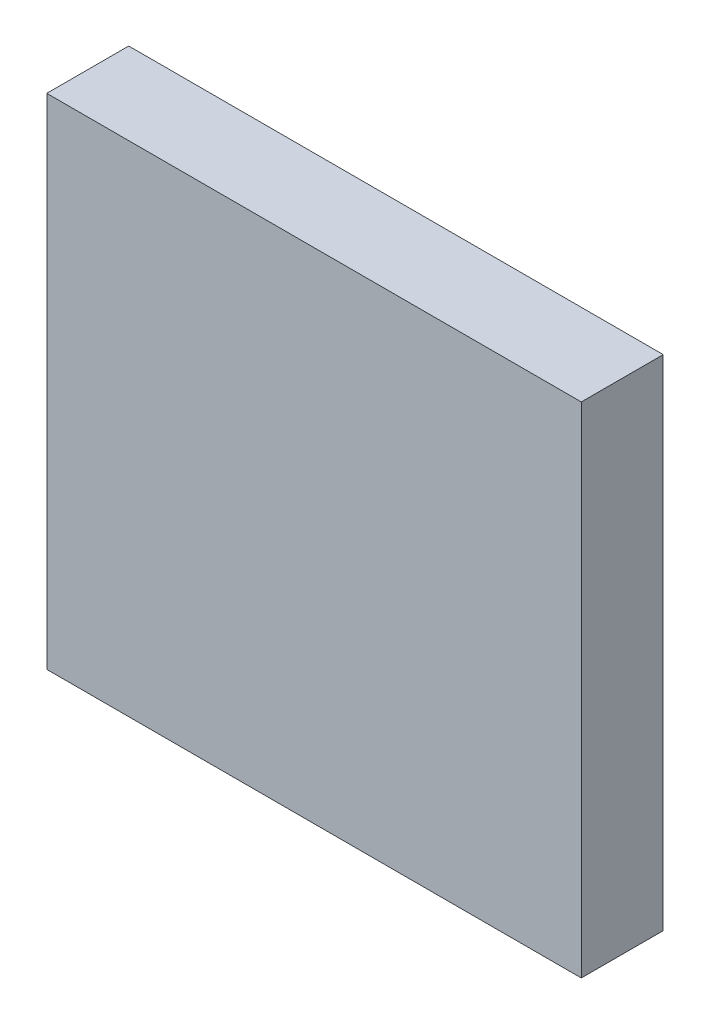
ISO-10303-21;
HEADER;
FILE_DESCRIPTION(('STEP AP214'),'2;1');
FILE_NAME('part.step','',(''),(''),'','','');
FILE_SCHEMA(('AUTOMOTIVE_DESIGN { 1 0 10303 214 1 1 1 1 }'));
ENDSEC;
DATA;
#1=APPLICATION_CONTEXT('core data for automotive mechanical design processes');
#2=APPLICATION_PROTOCOL_DEFINITION('international standard','automotive_design',2000,#1);
#3=PRODUCT_CONTEXT('',#1,'mechanical');
#4=PRODUCT('Part','Part','',(#3));
#5=PRODUCT_RELATED_PRODUCT_CATEGORY('part','',(#4));
#6=PRODUCT_DEFINITION_FORMATION('','',#4);
#7=PRODUCT_DEFINITION_CONTEXT('part definition',#1,'design');
#8=PRODUCT_DEFINITION('design','',#6,#7);
#9=PRODUCT_DEFINITION_SHAPE('','',#8);
#10=(LENGTH_UNIT() NAMED_UNIT(*) SI_UNIT(.MILLI.,.METRE.));
#11=(NAMED_UNIT(*) PLANE_ANGLE_UNIT() SI_UNIT($,.RADIAN.));
#12=(NAMED_UNIT(*) SI_UNIT($,.STERADIAN.) SOLID_ANGLE_UNIT());
#13=UNCERTAINTY_MEASURE_WITH_UNIT(LENGTH_MEASURE(1.E-05),#10,'distance_accuracy_value','');
#14=(GEOMETRIC_REPRESENTATION_CONTEXT(3) GLOBAL_UNCERTAINTY_ASSIGNED_CONTEXT((#13)) GLOBAL_UNIT_ASSIGNED_CONTEXT((#10,
#11,#12)) REPRESENTATION_CONTEXT('',''));
#15=CARTESIAN_POINT('',(0.,0.,0.));
#16=DIRECTION('',(0.,0.,1.));
#17=DIRECTION('',(1.,0.,0.));
#18=AXIS2_PLACEMENT_3D('',#15,#16,#17);
#19=CARTESIAN_POINT('',(9.52500000000001,-8.89,2.921));
#20=DIRECTION('',(-1.,0.,0.));
#21=DIRECTION('',(0.,0.,1.));
#22=AXIS2_PLACEMENT_3D('',#19,#20,#21);
#23=PLANE('',#22);
#24=DIRECTION('',(0.,1.,0.));
#25=VECTOR('',#24,1.);
#26=CARTESIAN_POINT('',(9.52500000000001,-8.89,0.));
#27=LINE('',#26,#25);
#28=CARTESIAN_POINT('',(9.52500000000001,-8.89,0.));
#29=VERTEX_POINT('',#28);
#30=CARTESIAN_POINT('',(9.52500000000001,8.89,0.));
#31=VERTEX_POINT('',#30);
#32=EDGE_CURVE('E107',#29,#31,#27,.T.);
#33=ORIENTED_EDGE('',*,*,#32,.T.);
#34=DIRECTION('',(0.,0.,-1.));
#35=VECTOR('',#34,1.);
#36=CARTESIAN_POINT('',(9.52500000000001,8.89,2.921));
#37=LINE('',#36,#35);
#38=CARTESIAN_POINT('',(9.52500000000001,8.89,2.921));
#39=VERTEX_POINT('',#38);
#40=EDGE_CURVE('E11',#39,#31,#37,.T.);
#41=ORIENTED_EDGE('',*,*,#40,.F.);
#42=DIRECTION('',(0.,1.,0.));
#43=VECTOR('',#42,1.);
#44=CARTESIAN_POINT('',(9.52500000000001,-8.89,2.921));
#45=LINE('',#44,#43);
#46=CARTESIAN_POINT('',(9.52500000000001,-8.89,2.921));
#47=VERTEX_POINT('',#46);
#48=EDGE_CURVE('E91',#47,#39,#45,.T.);
#49=ORIENTED_EDGE('',*,*,#48,.F.);
#50=DIRECTION('',(0.,0.,-1.));
#51=VECTOR('',#50,1.);
#52=CARTESIAN_POINT('',(9.52500000000001,-8.89,2.921));
#53=LINE('',#52,#51);
#54=EDGE_CURVE('E103',#47,#29,#53,.T.);
#55=ORIENTED_EDGE('',*,*,#54,.T.);
#56=EDGE_LOOP('',(#33,#41,#49,#55));
#57=FACE_BOUND('',#56,.T.);
#58=ADVANCED_FACE('F39',(#57),#23,.F.);
#59=CARTESIAN_POINT('',(-9.525,8.89,2.921));
#60=DIRECTION('',(0.,-1.,0.));
#61=DIRECTION('',(0.,0.,-1.));
#62=AXIS2_PLACEMENT_3D('',#59,#60,#61);
#63=PLANE('',#62);
#64=DIRECTION('',(-1.,0.,0.));
#65=VECTOR('',#64,1.);
#66=CARTESIAN_POINT('',(-9.525,8.89,0.));
#67=LINE('',#66,#65);
#68=CARTESIAN_POINT('',(-9.525,8.89,0.));
#69=VERTEX_POINT('',#68);
#70=EDGE_CURVE('E96',#31,#69,#67,.T.);
#71=ORIENTED_EDGE('',*,*,#70,.T.);
#72=DIRECTION('',(0.,0.,-1.));
#73=VECTOR('',#72,1.);
#74=CARTESIAN_POINT('',(-9.525,8.89,2.921));
#75=LINE('',#74,#73);
#76=CARTESIAN_POINT('',(-9.525,8.89,2.921));
#77=VERTEX_POINT('',#76);
#78=EDGE_CURVE('E48',#77,#69,#75,.T.);
#79=ORIENTED_EDGE('',*,*,#78,.F.);
#80=DIRECTION('',(-1.,0.,0.));
#81=VECTOR('',#80,1.);
#82=CARTESIAN_POINT('',(-9.525,8.89,2.921));
#83=LINE('',#82,#81);
#84=EDGE_CURVE('E86',#39,#77,#83,.T.);
#85=ORIENTED_EDGE('',*,*,#84,.F.);
#86=ORIENTED_EDGE('',*,*,#40,.T.);
#87=EDGE_LOOP('',(#71,#79,#85,#86));
#88=FACE_BOUND('',#87,.T.);
#89=ADVANCED_FACE('F95',(#88),#63,.F.);
#90=CARTESIAN_POINT('',(-9.525,-8.89,2.921));
#91=DIRECTION('',(1.,0.,0.));
#92=DIRECTION('',(0.,0.,-1.));
#93=AXIS2_PLACEMENT_3D('',#90,#91,#92);
#94=PLANE('',#93);
#95=DIRECTION('',(0.,-1.,0.));
#96=VECTOR('',#95,1.);
#97=CARTESIAN_POINT('',(-9.525,-8.89,0.));
#98=LINE('',#97,#96);
#99=CARTESIAN_POINT('',(-9.525,-8.89,0.));
#100=VERTEX_POINT('',#99);
#101=EDGE_CURVE('E73',#69,#100,#98,.T.);
#102=ORIENTED_EDGE('',*,*,#101,.T.);
#103=DIRECTION('',(0.,0.,-1.));
#104=VECTOR('',#103,1.);
#105=CARTESIAN_POINT('',(-9.525,-8.89,2.921));
#106=LINE('',#105,#104);
#107=CARTESIAN_POINT('',(-9.525,-8.89,2.921));
#108=VERTEX_POINT('',#107);
#109=EDGE_CURVE('E98',#108,#100,#106,.T.);
#110=ORIENTED_EDGE('',*,*,#109,.F.);
#111=DIRECTION('',(0.,-1.,0.));
#112=VECTOR('',#111,1.);
#113=CARTESIAN_POINT('',(-9.525,-8.89,2.921));
#114=LINE('',#113,#112);
#115=EDGE_CURVE('E89',#77,#108,#114,.T.);
#116=ORIENTED_EDGE('',*,*,#115,.F.);
#117=ORIENTED_EDGE('',*,*,#78,.T.);
#118=EDGE_LOOP('',(#102,#110,#116,#117));
#119=FACE_BOUND('',#118,.T.);
#120=ADVANCED_FACE('F99',(#119),#94,.F.);
#121=CARTESIAN_POINT('',(-9.525,-8.89,2.921));
#122=DIRECTION('',(0.,1.,0.));
#123=DIRECTION('',(0.,0.,1.));
#124=AXIS2_PLACEMENT_3D('',#121,#122,#123);
#125=PLANE('',#124);
#126=DIRECTION('',(1.,0.,0.));
#127=VECTOR('',#126,1.);
#128=CARTESIAN_POINT('',(-9.525,-8.89,0.));
#129=LINE('',#128,#127);
#130=EDGE_CURVE('E79',#100,#29,#129,.T.);
#131=ORIENTED_EDGE('',*,*,#130,.T.);
#132=ORIENTED_EDGE('',*,*,#54,.F.);
#133=DIRECTION('',(1.,0.,0.));
#134=VECTOR('',#133,1.);
#135=CARTESIAN_POINT('',(-9.525,-8.89,2.921));
#136=LINE('',#135,#134);
#137=EDGE_CURVE('E56',#108,#47,#136,.T.);
#138=ORIENTED_EDGE('',*,*,#137,.F.);
#139=ORIENTED_EDGE('',*,*,#109,.T.);
#140=EDGE_LOOP('',(#131,#132,#138,#139));
#141=FACE_BOUND('',#140,.T.);
#142=ADVANCED_FACE('F120',(#141),#125,.F.);
#143=CARTESIAN_POINT('',(0.,0.,2.921));
#144=DIRECTION('',(0.,0.,-1.));
#145=DIRECTION('',(-1.,0.,0.));
#146=AXIS2_PLACEMENT_3D('',#143,#144,#145);
#147=PLANE('',#146);
#148=ORIENTED_EDGE('',*,*,#48,.T.);
#149=ORIENTED_EDGE('',*,*,#84,.T.);
#150=ORIENTED_EDGE('',*,*,#115,.T.);
#151=ORIENTED_EDGE('',*,*,#137,.T.);
#152=EDGE_LOOP('',(#148,#149,#150,#151));
#153=FACE_BOUND('',#152,.T.);
#154=ADVANCED_FACE('F87',(#153),#147,.F.);
#155=CARTESIAN_POINT('',(0.,0.,0.));
#156=DIRECTION('',(0.,0.,-1.));
#157=DIRECTION('',(-1.,0.,0.));
#158=AXIS2_PLACEMENT_3D('',#155,#156,#157);
#159=PLANE('',#158);
#160=ORIENTED_EDGE('',*,*,#32,.F.);
#161=ORIENTED_EDGE('',*,*,#130,.F.);
#162=ORIENTED_EDGE('',*,*,#101,.F.);
#163=ORIENTED_EDGE('',*,*,#70,.F.);
#164=EDGE_LOOP('',(#160,#161,#162,#163));
#165=FACE_BOUND('',#164,.T.);
#166=ADVANCED_FACE('F123',(#165),#159,.T.);
#167=CLOSED_SHELL('',(#58,#89,#120,#142,#154,#166));
#168=MANIFOLD_SOLID_BREP('B2',#167);
#169=ADVANCED_BREP_SHAPE_REPRESENTATION('',(#18,#168),#14);
#170=SHAPE_DEFINITION_REPRESENTATION(#9,#169);
ENDSEC;
END-ISO-10303-21;
